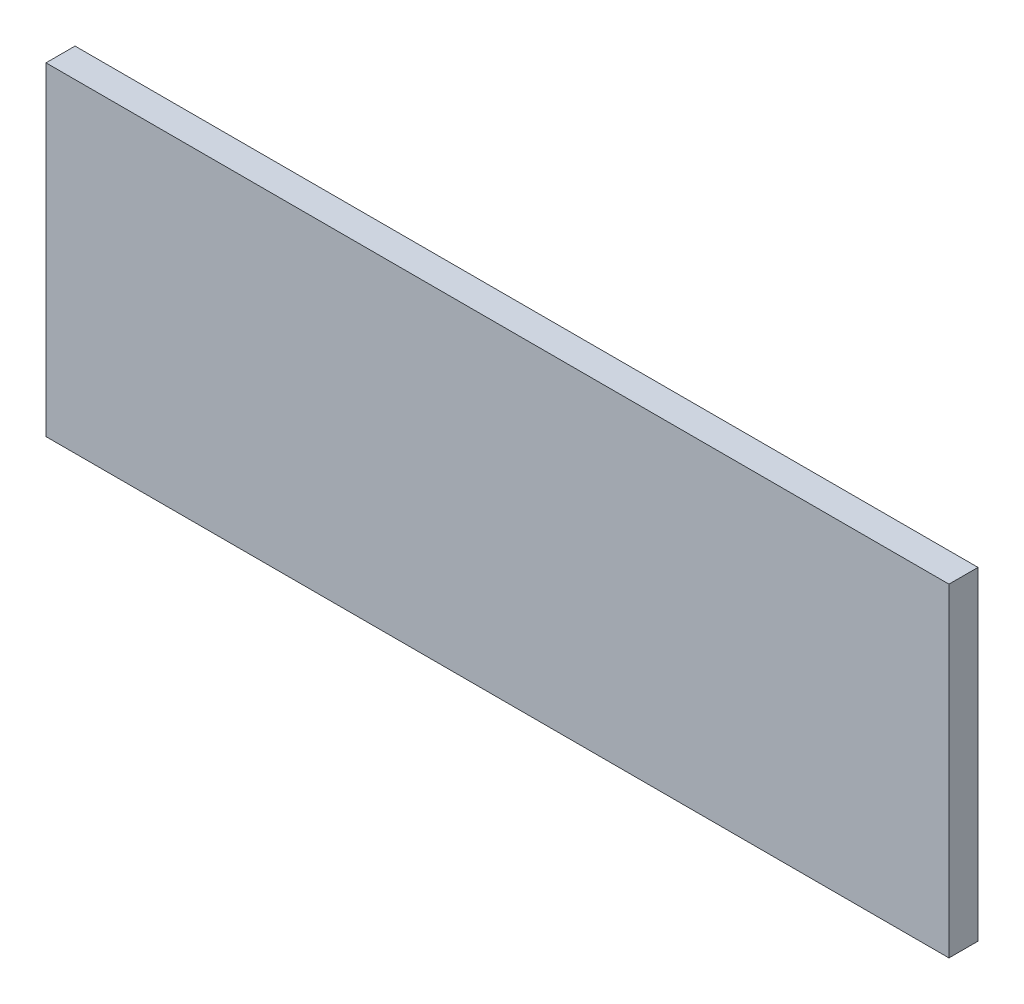
ISO-10303-21;
HEADER;
FILE_DESCRIPTION(('STEP AP214'),'2;1');
FILE_NAME('part.step','',(''),(''),'','','');
FILE_SCHEMA(('AUTOMOTIVE_DESIGN { 1 0 10303 214 1 1 1 1 }'));
ENDSEC;
DATA;
#1=APPLICATION_CONTEXT('core data for automotive mechanical design processes');
#2=APPLICATION_PROTOCOL_DEFINITION('international standard','automotive_design',2000,#1);
#3=PRODUCT_CONTEXT('',#1,'mechanical');
#4=PRODUCT('Part','Part','',(#3));
#5=PRODUCT_RELATED_PRODUCT_CATEGORY('part','',(#4));
#6=PRODUCT_DEFINITION_FORMATION('','',#4);
#7=PRODUCT_DEFINITION_CONTEXT('part definition',#1,'design');
#8=PRODUCT_DEFINITION('design','',#6,#7);
#9=PRODUCT_DEFINITION_SHAPE('','',#8);
#10=(LENGTH_UNIT() NAMED_UNIT(*) SI_UNIT(.MILLI.,.METRE.));
#11=(NAMED_UNIT(*) PLANE_ANGLE_UNIT() SI_UNIT($,.RADIAN.));
#12=(NAMED_UNIT(*) SI_UNIT($,.STERADIAN.) SOLID_ANGLE_UNIT());
#13=UNCERTAINTY_MEASURE_WITH_UNIT(LENGTH_MEASURE(1.E-05),#10,'distance_accuracy_value','');
#14=(GEOMETRIC_REPRESENTATION_CONTEXT(3) GLOBAL_UNCERTAINTY_ASSIGNED_CONTEXT((#13)) GLOBAL_UNIT_ASSIGNED_CONTEXT((#10,
#11,#12)) REPRESENTATION_CONTEXT('',''));
#15=CARTESIAN_POINT('',(0.,0.,0.));
#16=DIRECTION('',(0.,0.,1.));
#17=DIRECTION('',(1.,0.,0.));
#18=AXIS2_PLACEMENT_3D('',#15,#16,#17);
#19=CARTESIAN_POINT('',(31.1,11.15,2.));
#20=DIRECTION('',(-1.,0.,0.));
#21=DIRECTION('',(0.,-1.,0.));
#22=AXIS2_PLACEMENT_3D('',#19,#20,#21);
#23=PLANE('',#22);
#24=DIRECTION('',(0.,1.,0.));
#25=VECTOR('',#24,1.);
#26=CARTESIAN_POINT('',(31.1,11.15,0.));
#27=LINE('',#26,#25);
#28=CARTESIAN_POINT('',(31.1,-11.15,0.));
#29=VERTEX_POINT('',#28);
#30=CARTESIAN_POINT('',(31.1,11.15,0.));
#31=VERTEX_POINT('',#30);
#32=EDGE_CURVE('E96',#29,#31,#27,.T.);
#33=ORIENTED_EDGE('',*,*,#32,.T.);
#34=DIRECTION('',(0.,0.,-1.));
#35=VECTOR('',#34,1.);
#36=CARTESIAN_POINT('',(31.1,11.15,2.));
#37=LINE('',#36,#35);
#38=CARTESIAN_POINT('',(31.1,11.15,2.));
#39=VERTEX_POINT('',#38);
#40=EDGE_CURVE('E11',#39,#31,#37,.T.);
#41=ORIENTED_EDGE('',*,*,#40,.F.);
#42=DIRECTION('',(0.,1.,0.));
#43=VECTOR('',#42,1.);
#44=CARTESIAN_POINT('',(31.1,11.15,2.));
#45=LINE('',#44,#43);
#46=CARTESIAN_POINT('',(31.1,-11.15,2.));
#47=VERTEX_POINT('',#46);
#48=EDGE_CURVE('E84',#47,#39,#45,.T.);
#49=ORIENTED_EDGE('',*,*,#48,.F.);
#50=DIRECTION('',(0.,0.,-1.));
#51=VECTOR('',#50,1.);
#52=CARTESIAN_POINT('',(31.1,-11.15,2.));
#53=LINE('',#52,#51);
#54=EDGE_CURVE('E92',#47,#29,#53,.T.);
#55=ORIENTED_EDGE('',*,*,#54,.T.);
#56=EDGE_LOOP('',(#33,#41,#49,#55));
#57=FACE_BOUND('',#56,.T.);
#58=ADVANCED_FACE('F33',(#57),#23,.F.);
#59=CARTESIAN_POINT('',(-31.1,11.15,2.));
#60=DIRECTION('',(0.,-1.,0.));
#61=DIRECTION('',(0.,0.,-1.));
#62=AXIS2_PLACEMENT_3D('',#59,#60,#61);
#63=PLANE('',#62);
#64=DIRECTION('',(-1.,0.,0.));
#65=VECTOR('',#64,1.);
#66=CARTESIAN_POINT('',(-31.1,11.15,0.));
#67=LINE('',#66,#65);
#68=CARTESIAN_POINT('',(-31.1,11.15,0.));
#69=VERTEX_POINT('',#68);
#70=EDGE_CURVE('E88',#31,#69,#67,.T.);
#71=ORIENTED_EDGE('',*,*,#70,.T.);
#72=DIRECTION('',(0.,0.,-1.));
#73=VECTOR('',#72,1.);
#74=CARTESIAN_POINT('',(-31.1,11.15,2.));
#75=LINE('',#74,#73);
#76=CARTESIAN_POINT('',(-31.1,11.15,2.));
#77=VERTEX_POINT('',#76);
#78=EDGE_CURVE('E41',#77,#69,#75,.T.);
#79=ORIENTED_EDGE('',*,*,#78,.F.);
#80=DIRECTION('',(-1.,0.,0.));
#81=VECTOR('',#80,1.);
#82=CARTESIAN_POINT('',(-31.1,11.15,2.));
#83=LINE('',#82,#81);
#84=EDGE_CURVE('E79',#39,#77,#83,.T.);
#85=ORIENTED_EDGE('',*,*,#84,.F.);
#86=ORIENTED_EDGE('',*,*,#40,.T.);
#87=EDGE_LOOP('',(#71,#79,#85,#86));
#88=FACE_BOUND('',#87,.T.);
#89=ADVANCED_FACE('F87',(#88),#63,.F.);
#90=CARTESIAN_POINT('',(-31.1,11.15,2.));
#91=DIRECTION('',(1.,0.,0.));
#92=DIRECTION('',(0.,1.,0.));
#93=AXIS2_PLACEMENT_3D('',#90,#91,#92);
#94=PLANE('',#93);
#95=DIRECTION('',(0.,-1.,0.));
#96=VECTOR('',#95,1.);
#97=CARTESIAN_POINT('',(-31.1,11.15,0.));
#98=LINE('',#97,#96);
#99=CARTESIAN_POINT('',(-31.1,-11.15,0.));
#100=VERTEX_POINT('',#99);
#101=EDGE_CURVE('E66',#69,#100,#98,.T.);
#102=ORIENTED_EDGE('',*,*,#101,.T.);
#103=DIRECTION('',(0.,0.,-1.));
#104=VECTOR('',#103,1.);
#105=CARTESIAN_POINT('',(-31.1,-11.15,2.));
#106=LINE('',#105,#104);
#107=CARTESIAN_POINT('',(-31.1,-11.15,2.));
#108=VERTEX_POINT('',#107);
#109=EDGE_CURVE('E89',#108,#100,#106,.T.);
#110=ORIENTED_EDGE('',*,*,#109,.F.);
#111=DIRECTION('',(0.,-1.,0.));
#112=VECTOR('',#111,1.);
#113=CARTESIAN_POINT('',(-31.1,11.15,2.));
#114=LINE('',#113,#112);
#115=EDGE_CURVE('E82',#77,#108,#114,.T.);
#116=ORIENTED_EDGE('',*,*,#115,.F.);
#117=ORIENTED_EDGE('',*,*,#78,.T.);
#118=EDGE_LOOP('',(#102,#110,#116,#117));
#119=FACE_BOUND('',#118,.T.);
#120=ADVANCED_FACE('F90',(#119),#94,.F.);
#121=CARTESIAN_POINT('',(-31.1,-11.15,2.));
#122=DIRECTION('',(0.,1.,0.));
#123=DIRECTION('',(0.,0.,1.));
#124=AXIS2_PLACEMENT_3D('',#121,#122,#123);
#125=PLANE('',#124);
#126=DIRECTION('',(1.,0.,0.));
#127=VECTOR('',#126,1.);
#128=CARTESIAN_POINT('',(-31.1,-11.15,0.));
#129=LINE('',#128,#127);
#130=EDGE_CURVE('E72',#100,#29,#129,.T.);
#131=ORIENTED_EDGE('',*,*,#130,.T.);
#132=ORIENTED_EDGE('',*,*,#54,.F.);
#133=DIRECTION('',(1.,0.,0.));
#134=VECTOR('',#133,1.);
#135=CARTESIAN_POINT('',(-31.1,-11.15,2.));
#136=LINE('',#135,#134);
#137=EDGE_CURVE('E49',#108,#47,#136,.T.);
#138=ORIENTED_EDGE('',*,*,#137,.F.);
#139=ORIENTED_EDGE('',*,*,#109,.T.);
#140=EDGE_LOOP('',(#131,#132,#138,#139));
#141=FACE_BOUND('',#140,.T.);
#142=ADVANCED_FACE('F103',(#141),#125,.F.);
#143=CARTESIAN_POINT('',(0.,0.,2.));
#144=DIRECTION('',(0.,0.,1.));
#145=DIRECTION('',(1.,0.,0.));
#146=AXIS2_PLACEMENT_3D('',#143,#144,#145);
#147=PLANE('',#146);
#148=ORIENTED_EDGE('',*,*,#48,.T.);
#149=ORIENTED_EDGE('',*,*,#84,.T.);
#150=ORIENTED_EDGE('',*,*,#115,.T.);
#151=ORIENTED_EDGE('',*,*,#137,.T.);
#152=EDGE_LOOP('',(#148,#149,#150,#151));
#153=FACE_BOUND('',#152,.T.);
#154=ADVANCED_FACE('F80',(#153),#147,.T.);
#155=CARTESIAN_POINT('',(0.,0.,0.));
#156=DIRECTION('',(0.,0.,1.));
#157=DIRECTION('',(1.,0.,0.));
#158=AXIS2_PLACEMENT_3D('',#155,#156,#157);
#159=PLANE('',#158);
#160=ORIENTED_EDGE('',*,*,#32,.F.);
#161=ORIENTED_EDGE('',*,*,#130,.F.);
#162=ORIENTED_EDGE('',*,*,#101,.F.);
#163=ORIENTED_EDGE('',*,*,#70,.F.);
#164=EDGE_LOOP('',(#160,#161,#162,#163));
#165=FACE_BOUND('',#164,.T.);
#166=ADVANCED_FACE('F106',(#165),#159,.F.);
#167=CLOSED_SHELL('',(#58,#89,#120,#142,#154,#166));
#168=MANIFOLD_SOLID_BREP('B2',#167);
#169=ADVANCED_BREP_SHAPE_REPRESENTATION('',(#18,#168),#14);
#170=SHAPE_DEFINITION_REPRESENTATION(#9,#169);
ENDSEC;
END-ISO-10303-21;
